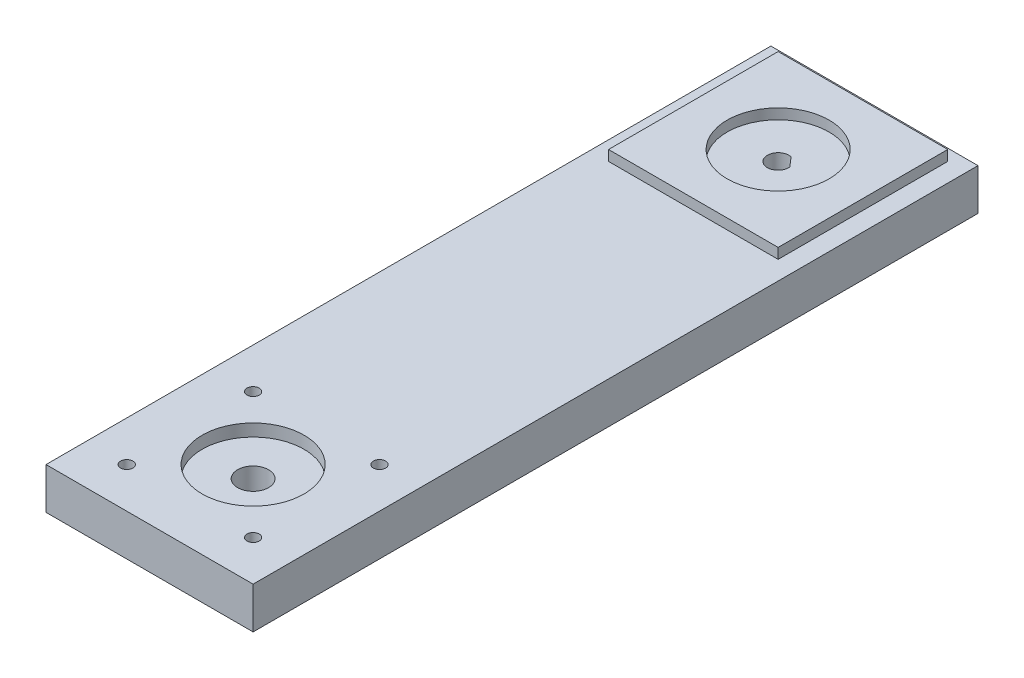
ISO-10303-21;
HEADER;
FILE_DESCRIPTION(('STEP AP214'),'2;1');
FILE_NAME('part.step','',(''),(''),'','','');
FILE_SCHEMA(('AUTOMOTIVE_DESIGN { 1 0 10303 214 1 1 1 1 }'));
ENDSEC;
DATA;
#1=APPLICATION_CONTEXT('core data for automotive mechanical design processes');
#2=APPLICATION_PROTOCOL_DEFINITION('international standard','automotive_design',2000,#1);
#3=PRODUCT_CONTEXT('',#1,'mechanical');
#4=PRODUCT('Part','Part','',(#3));
#5=PRODUCT_RELATED_PRODUCT_CATEGORY('part','',(#4));
#6=PRODUCT_DEFINITION_FORMATION('','',#4);
#7=PRODUCT_DEFINITION_CONTEXT('part definition',#1,'design');
#8=PRODUCT_DEFINITION('design','',#6,#7);
#9=PRODUCT_DEFINITION_SHAPE('','',#8);
#10=(LENGTH_UNIT() NAMED_UNIT(*) SI_UNIT(.MILLI.,.METRE.));
#11=(NAMED_UNIT(*) PLANE_ANGLE_UNIT() SI_UNIT($,.RADIAN.));
#12=(NAMED_UNIT(*) SI_UNIT($,.STERADIAN.) SOLID_ANGLE_UNIT());
#13=UNCERTAINTY_MEASURE_WITH_UNIT(LENGTH_MEASURE(1.E-05),#10,'distance_accuracy_value','');
#14=(GEOMETRIC_REPRESENTATION_CONTEXT(3) GLOBAL_UNCERTAINTY_ASSIGNED_CONTEXT((#13)) GLOBAL_UNIT_ASSIGNED_CONTEXT((#10,
#11,#12)) REPRESENTATION_CONTEXT('',''));
#15=CARTESIAN_POINT('',(0.,0.,0.));
#16=DIRECTION('',(0.,0.,1.));
#17=DIRECTION('',(1.,0.,0.));
#18=AXIS2_PLACEMENT_3D('',#15,#16,#17);
#19=CARTESIAN_POINT('',(0.,72.85,128.777676550252));
#20=DIRECTION('',(0.,-1.,0.));
#21=DIRECTION('',(0.,0.,-1.));
#22=AXIS2_PLACEMENT_3D('',#19,#20,#21);
#23=CYLINDRICAL_SURFACE('',#22,3.81);
#24=CARTESIAN_POINT('',(0.,41.91,128.777676550252));
#25=DIRECTION('',(0.,-1.,0.));
#26=DIRECTION('',(0.,0.,-1.));
#27=AXIS2_PLACEMENT_3D('',#24,#25,#26);
#28=CIRCLE('',#27,3.81);
#29=CARTESIAN_POINT('',(0.,41.91,124.967676550252));
#30=VERTEX_POINT('',#29);
#31=EDGE_CURVE('E214',#30,#30,#28,.T.);
#32=CARTESIAN_POINT('',(0.,49.07,128.777676550252));
#33=DIRECTION('',(0.,1.,0.));
#34=DIRECTION('',(0.,0.,1.));
#35=AXIS2_PLACEMENT_3D('',#32,#33,#34);
#36=CIRCLE('',#35,3.81);
#37=CARTESIAN_POINT('',(0.,49.07,124.967676550252));
#38=VERTEX_POINT('',#37);
#39=EDGE_CURVE('E195',#38,#38,#36,.F.);
#40=CARTESIAN_POINT('',(0.,41.91,124.967676550252));
#41=CARTESIAN_POINT('',(0.,41.9845833333333,124.967676550252));
#42=CARTESIAN_POINT('',(0.,42.0591666666667,124.967676550252));
#43=CARTESIAN_POINT('',(0.,42.2083333333333,124.967676550252));
#44=CARTESIAN_POINT('',(0.,42.2829166666667,124.967676550252));
#45=CARTESIAN_POINT('',(0.,42.4320833333333,124.967676550252));
#46=CARTESIAN_POINT('',(0.,42.5066666666667,124.967676550252));
#47=CARTESIAN_POINT('',(0.,42.6558333333333,124.967676550252));
#48=CARTESIAN_POINT('',(0.,42.7304166666667,124.967676550252));
#49=CARTESIAN_POINT('',(0.,42.8795833333333,124.967676550252));
#50=CARTESIAN_POINT('',(0.,42.9541666666667,124.967676550252));
#51=CARTESIAN_POINT('',(0.,43.1033333333333,124.967676550252));
#52=CARTESIAN_POINT('',(0.,43.1779166666667,124.967676550252));
#53=CARTESIAN_POINT('',(0.,43.3270833333333,124.967676550252));
#54=CARTESIAN_POINT('',(0.,43.4016666666667,124.967676550252));
#55=CARTESIAN_POINT('',(0.,43.5508333333333,124.967676550252));
#56=CARTESIAN_POINT('',(0.,43.6254166666667,124.967676550252));
#57=CARTESIAN_POINT('',(0.,43.7745833333333,124.967676550252));
#58=CARTESIAN_POINT('',(0.,43.8491666666667,124.967676550252));
#59=CARTESIAN_POINT('',(0.,43.9983333333333,124.967676550252));
#60=CARTESIAN_POINT('',(0.,44.0729166666667,124.967676550252));
#61=CARTESIAN_POINT('',(0.,44.2220833333333,124.967676550252));
#62=CARTESIAN_POINT('',(0.,44.2966666666667,124.967676550252));
#63=CARTESIAN_POINT('',(0.,44.4458333333333,124.967676550252));
#64=CARTESIAN_POINT('',(0.,44.5204166666667,124.967676550252));
#65=CARTESIAN_POINT('',(0.,44.6695833333333,124.967676550252));
#66=CARTESIAN_POINT('',(0.,44.7441666666667,124.967676550252));
#67=CARTESIAN_POINT('',(0.,44.8933333333333,124.967676550252));
#68=CARTESIAN_POINT('',(0.,44.9679166666667,124.967676550252));
#69=CARTESIAN_POINT('',(0.,45.1170833333333,124.967676550252));
#70=CARTESIAN_POINT('',(0.,45.1916666666667,124.967676550252));
#71=CARTESIAN_POINT('',(0.,45.3408333333333,124.967676550252));
#72=CARTESIAN_POINT('',(0.,45.4154166666667,124.967676550252));
#73=CARTESIAN_POINT('',(0.,45.5645833333333,124.967676550252));
#74=CARTESIAN_POINT('',(0.,45.6391666666667,124.967676550252));
#75=CARTESIAN_POINT('',(0.,45.7883333333333,124.967676550252));
#76=CARTESIAN_POINT('',(0.,45.8629166666667,124.967676550252));
#77=CARTESIAN_POINT('',(0.,46.0120833333333,124.967676550252));
#78=CARTESIAN_POINT('',(0.,46.0866666666667,124.967676550252));
#79=CARTESIAN_POINT('',(0.,46.2358333333333,124.967676550252));
#80=CARTESIAN_POINT('',(0.,46.3104166666667,124.967676550252));
#81=CARTESIAN_POINT('',(0.,46.4595833333333,124.967676550252));
#82=CARTESIAN_POINT('',(0.,46.5341666666667,124.967676550252));
#83=CARTESIAN_POINT('',(0.,46.6833333333333,124.967676550252));
#84=CARTESIAN_POINT('',(0.,46.7579166666667,124.967676550252));
#85=CARTESIAN_POINT('',(0.,46.9070833333333,124.967676550252));
#86=CARTESIAN_POINT('',(0.,46.9816666666667,124.967676550252));
#87=CARTESIAN_POINT('',(0.,47.1308333333333,124.967676550252));
#88=CARTESIAN_POINT('',(0.,47.2054166666667,124.967676550252));
#89=CARTESIAN_POINT('',(0.,47.3545833333333,124.967676550252));
#90=CARTESIAN_POINT('',(0.,47.4291666666667,124.967676550252));
#91=CARTESIAN_POINT('',(0.,47.5783333333333,124.967676550252));
#92=CARTESIAN_POINT('',(0.,47.6529166666667,124.967676550252));
#93=CARTESIAN_POINT('',(0.,47.8020833333333,124.967676550252));
#94=CARTESIAN_POINT('',(0.,47.8766666666667,124.967676550252));
#95=CARTESIAN_POINT('',(0.,48.0258333333333,124.967676550252));
#96=CARTESIAN_POINT('',(0.,48.1004166666667,124.967676550252));
#97=CARTESIAN_POINT('',(0.,48.2495833333333,124.967676550252));
#98=CARTESIAN_POINT('',(0.,48.3241666666667,124.967676550252));
#99=CARTESIAN_POINT('',(0.,48.4733333333333,124.967676550252));
#100=CARTESIAN_POINT('',(0.,48.5479166666667,124.967676550252));
#101=CARTESIAN_POINT('',(0.,48.6970833333333,124.967676550252));
#102=CARTESIAN_POINT('',(0.,48.7716666666667,124.967676550252));
#103=CARTESIAN_POINT('',(0.,48.9208333333333,124.967676550252));
#104=CARTESIAN_POINT('',(0.,48.9954166666667,124.967676550252));
#105=CARTESIAN_POINT('',(0.,49.07,124.967676550252));
#106=B_SPLINE_CURVE_WITH_KNOTS('',3,(#40,#41,#42,#43,#44,#45,#46,#47,#48,#49,#50,#51,#52,#53,
#54,#55,#56,#57,#58,#59,#60,#61,#62,#63,#64,#65,#66,#67,#68,#69,#70,#71,#72,#73,#74,#75,#76,#77,
#78,#79,#80,#81,#82,#83,#84,#85,#86,#87,#88,#89,#90,#91,#92,#93,#94,#95,#96,#97,#98,#99,#100,
#101,#102,#103,#104,#105),.UNSPECIFIED.,.F.,.F.,(4,2,2,2,2,2,2,2,2,2,2,2,2,2,2,2,2,2,2,2,2,2,2,
2,2,2,2,2,2,2,2,2,4),(0.,0.223749999999995,0.447499999999997,0.671249999999998,
0.894999999999993,1.11874999999999,1.3425,1.56624999999999,1.79,2.01374999999999,
2.23749999999999,2.46125,2.68499999999999,2.90874999999999,3.1325,3.35624999999999,
3.57999999999999,3.80374999999999,4.02749999999999,4.25124999999999,4.47499999999999,
4.69874999999999,4.9225,5.14624999999999,5.36999999999999,5.59374999999999,5.81749999999999,
6.04124999999999,6.26499999999999,6.48874999999999,6.71249999999999,6.93624999999999,
7.15999999999999),.UNSPECIFIED.);
#107=EDGE_CURVE('BSEAM41',#30,#38,#106,.T.);
#108=ORIENTED_EDGE('',*,*,#31,.T.);
#109=ORIENTED_EDGE('',*,*,#39,.F.);
#110=ORIENTED_EDGE('',*,*,#107,.T.);
#111=ORIENTED_EDGE('',*,*,#107,.F.);
#112=EDGE_LOOP('',(#108,#110,#109,#111));
#113=FACE_BOUND('',#112,.T.);
#114=ADVANCED_FACE('F41',(#113),#23,.F.);
#115=CARTESIAN_POINT('',(0.,52.07,0.));
#116=DIRECTION('',(0.,1.,0.));
#117=DIRECTION('',(0.,0.,1.));
#118=AXIS2_PLACEMENT_3D('',#115,#116,#117);
#119=PLANE('',#118);
#120=CARTESIAN_POINT('',(0.,52.07,0.));
#121=DIRECTION('',(0.,1.,0.));
#122=DIRECTION('',(0.,0.,1.));
#123=AXIS2_PLACEMENT_3D('',#120,#121,#122);
#124=CIRCLE('',#123,12.5);
#125=CARTESIAN_POINT('',(0.,52.07,12.5));
#126=VERTEX_POINT('',#125);
#127=EDGE_CURVE('E49',#126,#126,#124,.F.);
#128=ORIENTED_EDGE('',*,*,#127,.F.);
#129=EDGE_LOOP('',(#128));
#130=FACE_BOUND('',#129,.T.);
#131=CARTESIAN_POINT('',(0.,52.07,0.));
#132=DIRECTION('',(0.,1.,0.));
#133=DIRECTION('',(0.,0.,1.));
#134=AXIS2_PLACEMENT_3D('',#131,#132,#133);
#135=CIRCLE('',#134,2.6399145772898);
#136=CARTESIAN_POINT('',(0.602559076609882,52.07,-2.57022791490993));
#137=VERTEX_POINT('',#136);
#138=CARTESIAN_POINT('',(2.62841352465712,52.07,-0.246153039361187));
#139=VERTEX_POINT('',#138);
#140=EDGE_CURVE('E124',#137,#139,#135,.T.);
#141=ORIENTED_EDGE('',*,*,#140,.F.);
#142=DIRECTION('',(0.65708689551593,0.,0.753814839162269));
#143=VECTOR('',#142,1.);
#144=CARTESIAN_POINT('',(1.6154863006335,52.07,-1.40819047713556));
#145=LINE('',#144,#143);
#146=EDGE_CURVE('E233',#137,#139,#145,.T.);
#147=ORIENTED_EDGE('',*,*,#146,.T.);
#148=EDGE_LOOP('',(#141,#147));
#149=FACE_BOUND('',#148,.T.);
#150=ADVANCED_FACE('F235',(#130,#149),#119,.T.);
#151=CARTESIAN_POINT('',(-25.4,52.07,-23.6223234497477));
#152=DIRECTION('',(1.,0.,0.));
#153=DIRECTION('',(0.,0.,-1.));
#154=AXIS2_PLACEMENT_3D('',#151,#152,#153);
#155=PLANE('',#154);
#156=DIRECTION('',(0.,0.,1.));
#157=VECTOR('',#156,1.);
#158=CARTESIAN_POINT('',(-25.4,41.91,-23.6223234497477));
#159=LINE('',#158,#157);
#160=CARTESIAN_POINT('',(-25.4,41.91,-23.6223234497477));
#161=VERTEX_POINT('',#160);
#162=CARTESIAN_POINT('',(-25.4,41.91,154.177676550252));
#163=VERTEX_POINT('',#162);
#164=EDGE_CURVE('E165',#161,#163,#159,.T.);
#165=ORIENTED_EDGE('',*,*,#164,.T.);
#166=DIRECTION('',(0.,-1.,0.));
#167=VECTOR('',#166,1.);
#168=CARTESIAN_POINT('',(-25.4,52.07,154.177676550252));
#169=LINE('',#168,#167);
#170=CARTESIAN_POINT('',(-25.4,52.07,154.177676550252));
#171=VERTEX_POINT('',#170);
#172=EDGE_CURVE('E191',#171,#163,#169,.T.);
#173=ORIENTED_EDGE('',*,*,#172,.F.);
#174=DIRECTION('',(0.,0.,1.));
#175=VECTOR('',#174,1.);
#176=CARTESIAN_POINT('',(-25.4,52.07,-23.6223234497477));
#177=LINE('',#176,#175);
#178=CARTESIAN_POINT('',(-25.4,52.07,-23.6223234497477));
#179=VERTEX_POINT('',#178);
#180=EDGE_CURVE('E166',#179,#171,#177,.T.);
#181=ORIENTED_EDGE('',*,*,#180,.F.);
#182=DIRECTION('',(0.,-1.,0.));
#183=VECTOR('',#182,1.);
#184=CARTESIAN_POINT('',(-25.4,52.07,-23.6223234497477));
#185=LINE('',#184,#183);
#186=EDGE_CURVE('E176',#179,#161,#185,.T.);
#187=ORIENTED_EDGE('',*,*,#186,.T.);
#188=EDGE_LOOP('',(#165,#173,#181,#187));
#189=FACE_BOUND('',#188,.T.);
#190=ADVANCED_FACE('F43',(#189),#155,.F.);
#191=CARTESIAN_POINT('',(-25.4,52.07,154.177676550252));
#192=DIRECTION('',(0.,0.,-1.));
#193=DIRECTION('',(-1.,0.,0.));
#194=AXIS2_PLACEMENT_3D('',#191,#192,#193);
#195=PLANE('',#194);
#196=DIRECTION('',(1.,0.,0.));
#197=VECTOR('',#196,1.);
#198=CARTESIAN_POINT('',(-25.4,41.91,154.177676550252));
#199=LINE('',#198,#197);
#200=CARTESIAN_POINT('',(25.4,41.91,154.177676550252));
#201=VERTEX_POINT('',#200);
#202=EDGE_CURVE('E178',#163,#201,#199,.T.);
#203=ORIENTED_EDGE('',*,*,#202,.T.);
#204=DIRECTION('',(0.,-1.,0.));
#205=VECTOR('',#204,1.);
#206=CARTESIAN_POINT('',(25.4,52.07,154.177676550252));
#207=LINE('',#206,#205);
#208=CARTESIAN_POINT('',(25.4,52.07,154.177676550252));
#209=VERTEX_POINT('',#208);
#210=EDGE_CURVE('E188',#209,#201,#207,.T.);
#211=ORIENTED_EDGE('',*,*,#210,.F.);
#212=DIRECTION('',(1.,0.,0.));
#213=VECTOR('',#212,1.);
#214=CARTESIAN_POINT('',(-25.4,52.07,154.177676550252));
#215=LINE('',#214,#213);
#216=EDGE_CURVE('E169',#171,#209,#215,.T.);
#217=ORIENTED_EDGE('',*,*,#216,.F.);
#218=ORIENTED_EDGE('',*,*,#172,.T.);
#219=EDGE_LOOP('',(#203,#211,#217,#218));
#220=FACE_BOUND('',#219,.T.);
#221=ADVANCED_FACE('F245',(#220),#195,.F.);
#222=CARTESIAN_POINT('',(25.4,52.07,-23.6223234497477));
#223=DIRECTION('',(-1.,0.,0.));
#224=DIRECTION('',(0.,0.,1.));
#225=AXIS2_PLACEMENT_3D('',#222,#223,#224);
#226=PLANE('',#225);
#227=DIRECTION('',(0.,0.,-1.));
#228=VECTOR('',#227,1.);
#229=CARTESIAN_POINT('',(25.4,41.91,-23.6223234497477));
#230=LINE('',#229,#228);
#231=CARTESIAN_POINT('',(25.4,41.91,-23.6223234497477));
#232=VERTEX_POINT('',#231);
#233=EDGE_CURVE('E180',#201,#232,#230,.T.);
#234=ORIENTED_EDGE('',*,*,#233,.T.);
#235=DIRECTION('',(0.,-1.,0.));
#236=VECTOR('',#235,1.);
#237=CARTESIAN_POINT('',(25.4,52.07,-23.6223234497477));
#238=LINE('',#237,#236);
#239=CARTESIAN_POINT('',(25.4,52.07,-23.6223234497477));
#240=VERTEX_POINT('',#239);
#241=EDGE_CURVE('E185',#240,#232,#238,.T.);
#242=ORIENTED_EDGE('',*,*,#241,.F.);
#243=DIRECTION('',(0.,0.,-1.));
#244=VECTOR('',#243,1.);
#245=CARTESIAN_POINT('',(25.4,52.07,-23.6223234497477));
#246=LINE('',#245,#244);
#247=EDGE_CURVE('E172',#209,#240,#246,.T.);
#248=ORIENTED_EDGE('',*,*,#247,.F.);
#249=ORIENTED_EDGE('',*,*,#210,.T.);
#250=EDGE_LOOP('',(#234,#242,#248,#249));
#251=FACE_BOUND('',#250,.T.);
#252=ADVANCED_FACE('F263',(#251),#226,.F.);
#253=CARTESIAN_POINT('',(-25.4,52.07,-23.6223234497477));
#254=DIRECTION('',(0.,0.,1.));
#255=DIRECTION('',(1.,0.,0.));
#256=AXIS2_PLACEMENT_3D('',#253,#254,#255);
#257=PLANE('',#256);
#258=DIRECTION('',(-1.,0.,0.));
#259=VECTOR('',#258,1.);
#260=CARTESIAN_POINT('',(-25.4,41.91,-23.6223234497477));
#261=LINE('',#260,#259);
#262=EDGE_CURVE('E170',#232,#161,#261,.T.);
#263=ORIENTED_EDGE('',*,*,#262,.T.);
#264=ORIENTED_EDGE('',*,*,#186,.F.);
#265=DIRECTION('',(-1.,0.,0.));
#266=VECTOR('',#265,1.);
#267=CARTESIAN_POINT('',(-25.4,52.07,-23.6223234497477));
#268=LINE('',#267,#266);
#269=EDGE_CURVE('E174',#240,#179,#268,.T.);
#270=ORIENTED_EDGE('',*,*,#269,.F.);
#271=ORIENTED_EDGE('',*,*,#241,.T.);
#272=EDGE_LOOP('',(#263,#264,#270,#271));
#273=FACE_BOUND('',#272,.T.);
#274=ADVANCED_FACE('F254',(#273),#257,.F.);
#275=CARTESIAN_POINT('',(0.,52.07,128.777676550252));
#276=DIRECTION('',(0.,1.,0.));
#277=DIRECTION('',(0.,0.,1.));
#278=AXIS2_PLACEMENT_3D('',#275,#276,#277);
#279=CIRCLE('',#278,12.5);
#280=CARTESIAN_POINT('',(0.,52.07,141.277676550252));
#281=VERTEX_POINT('',#280);
#282=EDGE_CURVE('E120',#281,#281,#279,.T.);
#283=ORIENTED_EDGE('',*,*,#282,.F.);
#284=EDGE_LOOP('',(#283));
#285=FACE_BOUND('',#284,.T.);
#286=CARTESIAN_POINT('',(-15.5,52.07,113.277676550252));
#287=DIRECTION('',(0.,1.,0.));
#288=DIRECTION('',(0.,0.,1.));
#289=AXIS2_PLACEMENT_3D('',#286,#287,#288);
#290=CIRCLE('',#289,1.5);
#291=CARTESIAN_POINT('',(-15.5,52.07,111.777676550252));
#292=VERTEX_POINT('',#291);
#293=EDGE_CURVE('E231',#292,#292,#290,.T.);
#294=ORIENTED_EDGE('',*,*,#293,.F.);
#295=EDGE_LOOP('',(#294));
#296=FACE_BOUND('',#295,.T.);
#297=CARTESIAN_POINT('',(-15.5,52.07,144.277676550252));
#298=DIRECTION('',(0.,1.,0.));
#299=DIRECTION('',(0.,0.,1.));
#300=AXIS2_PLACEMENT_3D('',#297,#298,#299);
#301=CIRCLE('',#300,1.5);
#302=CARTESIAN_POINT('',(-15.5,52.07,142.777676550252));
#303=VERTEX_POINT('',#302);
#304=EDGE_CURVE('E228',#303,#303,#301,.T.);
#305=ORIENTED_EDGE('',*,*,#304,.F.);
#306=EDGE_LOOP('',(#305));
#307=FACE_BOUND('',#306,.T.);
#308=CARTESIAN_POINT('',(15.5,52.07,144.277676550252));
#309=DIRECTION('',(0.,1.,0.));
#310=DIRECTION('',(0.,0.,1.));
#311=AXIS2_PLACEMENT_3D('',#308,#309,#310);
#312=CIRCLE('',#311,1.5);
#313=CARTESIAN_POINT('',(15.5,52.07,142.777676550252));
#314=VERTEX_POINT('',#313);
#315=EDGE_CURVE('E225',#314,#314,#312,.T.);
#316=ORIENTED_EDGE('',*,*,#315,.F.);
#317=EDGE_LOOP('',(#316));
#318=FACE_BOUND('',#317,.T.);
#319=CARTESIAN_POINT('',(15.5,52.07,113.277676550252));
#320=DIRECTION('',(0.,1.,0.));
#321=DIRECTION('',(0.,0.,1.));
#322=AXIS2_PLACEMENT_3D('',#319,#320,#321);
#323=CIRCLE('',#322,1.5);
#324=CARTESIAN_POINT('',(15.5,52.07,111.777676550252));
#325=VERTEX_POINT('',#324);
#326=EDGE_CURVE('E222',#325,#325,#323,.T.);
#327=ORIENTED_EDGE('',*,*,#326,.F.);
#328=EDGE_LOOP('',(#327));
#329=FACE_BOUND('',#328,.T.);
#330=DIRECTION('',(0.,0.,-1.));
#331=VECTOR('',#330,1.);
#332=CARTESIAN_POINT('',(-20.7995624568902,52.07,0.));
#333=LINE('',#332,#331);
#334=CARTESIAN_POINT('',(-20.7995624568902,52.07,20.7995624568902));
#335=VERTEX_POINT('',#334);
#336=CARTESIAN_POINT('',(-20.7995624568902,52.07,-20.7995624568902));
#337=VERTEX_POINT('',#336);
#338=EDGE_CURVE('E126',#335,#337,#333,.T.);
#339=ORIENTED_EDGE('',*,*,#338,.T.);
#340=DIRECTION('',(-1.,0.,0.));
#341=VECTOR('',#340,1.);
#342=CARTESIAN_POINT('',(0.,52.07,-20.7995624568902));
#343=LINE('',#342,#341);
#344=CARTESIAN_POINT('',(20.7995624568902,52.07,-20.7995624568902));
#345=VERTEX_POINT('',#344);
#346=EDGE_CURVE('E139',#345,#337,#343,.T.);
#347=ORIENTED_EDGE('',*,*,#346,.F.);
#348=DIRECTION('',(0.,0.,-1.));
#349=VECTOR('',#348,1.);
#350=CARTESIAN_POINT('',(20.7995624568902,52.07,0.));
#351=LINE('',#350,#349);
#352=CARTESIAN_POINT('',(20.7995624568902,52.07,20.7995624568902));
#353=VERTEX_POINT('',#352);
#354=EDGE_CURVE('E153',#353,#345,#351,.T.);
#355=ORIENTED_EDGE('',*,*,#354,.F.);
#356=DIRECTION('',(-1.,0.,0.));
#357=VECTOR('',#356,1.);
#358=CARTESIAN_POINT('',(0.,52.07,20.7995624568902));
#359=LINE('',#358,#357);
#360=EDGE_CURVE('E129',#353,#335,#359,.T.);
#361=ORIENTED_EDGE('',*,*,#360,.T.);
#362=EDGE_LOOP('',(#339,#347,#355,#361));
#363=FACE_BOUND('',#362,.T.);
#364=ORIENTED_EDGE('',*,*,#180,.T.);
#365=ORIENTED_EDGE('',*,*,#216,.T.);
#366=ORIENTED_EDGE('',*,*,#247,.T.);
#367=ORIENTED_EDGE('',*,*,#269,.T.);
#368=EDGE_LOOP('',(#364,#365,#366,#367));
#369=FACE_BOUND('',#368,.T.);
#370=ADVANCED_FACE('F239',(#285,#296,#307,#318,#329,#363,#369),#119,.T.);
#371=CARTESIAN_POINT('',(0.,41.91,0.));
#372=DIRECTION('',(0.,1.,0.));
#373=DIRECTION('',(0.,0.,1.));
#374=AXIS2_PLACEMENT_3D('',#371,#372,#373);
#375=PLANE('',#374);
#376=CARTESIAN_POINT('',(-15.5,41.91,113.277676550252));
#377=DIRECTION('',(0.,-1.,0.));
#378=DIRECTION('',(0.,0.,-1.));
#379=AXIS2_PLACEMENT_3D('',#376,#377,#378);
#380=CIRCLE('',#379,1.5);
#381=CARTESIAN_POINT('',(-15.5,41.91,111.777676550252));
#382=VERTEX_POINT('',#381);
#383=EDGE_CURVE('E197',#382,#382,#380,.T.);
#384=ORIENTED_EDGE('',*,*,#383,.F.);
#385=EDGE_LOOP('',(#384));
#386=FACE_BOUND('',#385,.T.);
#387=CARTESIAN_POINT('',(-15.5,41.91,144.277676550252));
#388=DIRECTION('',(0.,-1.,0.));
#389=DIRECTION('',(0.,0.,-1.));
#390=AXIS2_PLACEMENT_3D('',#387,#388,#389);
#391=CIRCLE('',#390,1.5);
#392=CARTESIAN_POINT('',(-15.5,41.91,142.777676550252));
#393=VERTEX_POINT('',#392);
#394=EDGE_CURVE('E202',#393,#393,#391,.T.);
#395=ORIENTED_EDGE('',*,*,#394,.F.);
#396=EDGE_LOOP('',(#395));
#397=FACE_BOUND('',#396,.T.);
#398=CARTESIAN_POINT('',(15.5,41.91,144.277676550252));
#399=DIRECTION('',(0.,-1.,0.));
#400=DIRECTION('',(0.,0.,-1.));
#401=AXIS2_PLACEMENT_3D('',#398,#399,#400);
#402=CIRCLE('',#401,1.5);
#403=CARTESIAN_POINT('',(15.5,41.91,142.777676550252));
#404=VERTEX_POINT('',#403);
#405=EDGE_CURVE('E215',#404,#404,#402,.T.);
#406=ORIENTED_EDGE('',*,*,#405,.F.);
#407=EDGE_LOOP('',(#406));
#408=FACE_BOUND('',#407,.T.);
#409=CARTESIAN_POINT('',(15.5,41.91,113.277676550252));
#410=DIRECTION('',(0.,-1.,0.));
#411=DIRECTION('',(0.,0.,-1.));
#412=AXIS2_PLACEMENT_3D('',#409,#410,#411);
#413=CIRCLE('',#412,1.5);
#414=CARTESIAN_POINT('',(15.5,41.91,111.777676550252));
#415=VERTEX_POINT('',#414);
#416=EDGE_CURVE('E211',#415,#415,#413,.T.);
#417=ORIENTED_EDGE('',*,*,#416,.F.);
#418=EDGE_LOOP('',(#417));
#419=FACE_BOUND('',#418,.T.);
#420=ORIENTED_EDGE('',*,*,#31,.F.);
#421=EDGE_LOOP('',(#420));
#422=FACE_BOUND('',#421,.T.);
#423=ORIENTED_EDGE('',*,*,#202,.F.);
#424=ORIENTED_EDGE('',*,*,#164,.F.);
#425=ORIENTED_EDGE('',*,*,#262,.F.);
#426=ORIENTED_EDGE('',*,*,#233,.F.);
#427=EDGE_LOOP('',(#423,#424,#425,#426));
#428=FACE_BOUND('',#427,.T.);
#429=DIRECTION('',(-0.65708689551593,0.,-0.753814839162269));
#430=VECTOR('',#429,1.);
#431=CARTESIAN_POINT('',(1.6154863006335,41.91,-1.40819047713556));
#432=LINE('',#431,#430);
#433=CARTESIAN_POINT('',(2.62841352465712,41.91,-0.246153039361187));
#434=VERTEX_POINT('',#433);
#435=CARTESIAN_POINT('',(0.602559076609882,41.91,-2.57022791490993));
#436=VERTEX_POINT('',#435);
#437=EDGE_CURVE('E55',#434,#436,#432,.T.);
#438=ORIENTED_EDGE('',*,*,#437,.T.);
#439=CARTESIAN_POINT('',(0.,41.91,0.));
#440=DIRECTION('',(0.,1.,0.));
#441=DIRECTION('',(0.,0.,1.));
#442=AXIS2_PLACEMENT_3D('',#439,#440,#441);
#443=CIRCLE('',#442,2.6399145772898);
#444=EDGE_CURVE('E11',#434,#436,#443,.F.);
#445=ORIENTED_EDGE('',*,*,#444,.F.);
#446=EDGE_LOOP('',(#438,#445));
#447=FACE_BOUND('',#446,.T.);
#448=ADVANCED_FACE('F115',(#386,#397,#408,#419,#422,#428,#447),#375,.F.);
#449=CARTESIAN_POINT('',(-20.7995624568902,54.61,0.));
#450=DIRECTION('',(-1.,0.,0.));
#451=DIRECTION('',(0.,0.,1.));
#452=AXIS2_PLACEMENT_3D('',#449,#450,#451);
#453=PLANE('',#452);
#454=ORIENTED_EDGE('',*,*,#338,.F.);
#455=DIRECTION('',(0.,-1.,0.));
#456=VECTOR('',#455,1.);
#457=CARTESIAN_POINT('',(-20.7995624568902,54.61,20.7995624568902));
#458=LINE('',#457,#456);
#459=CARTESIAN_POINT('',(-20.7995624568902,54.61,20.7995624568902));
#460=VERTEX_POINT('',#459);
#461=EDGE_CURVE('E163',#460,#335,#458,.T.);
#462=ORIENTED_EDGE('',*,*,#461,.F.);
#463=DIRECTION('',(0.,0.,-1.));
#464=VECTOR('',#463,1.);
#465=CARTESIAN_POINT('',(-20.7995624568902,54.61,0.));
#466=LINE('',#465,#464);
#467=CARTESIAN_POINT('',(-20.7995624568902,54.61,-20.7995624568902));
#468=VERTEX_POINT('',#467);
#469=EDGE_CURVE('E138',#460,#468,#466,.T.);
#470=ORIENTED_EDGE('',*,*,#469,.T.);
#471=DIRECTION('',(0.,-1.,0.));
#472=VECTOR('',#471,1.);
#473=CARTESIAN_POINT('',(-20.7995624568902,54.61,-20.7995624568902));
#474=LINE('',#473,#472);
#475=EDGE_CURVE('E149',#468,#337,#474,.T.);
#476=ORIENTED_EDGE('',*,*,#475,.T.);
#477=EDGE_LOOP('',(#454,#462,#470,#476));
#478=FACE_BOUND('',#477,.T.);
#479=ADVANCED_FACE('F260',(#478),#453,.T.);
#480=CARTESIAN_POINT('',(0.,54.61,20.7995624568902));
#481=DIRECTION('',(0.,0.,1.));
#482=DIRECTION('',(1.,0.,0.));
#483=AXIS2_PLACEMENT_3D('',#480,#481,#482);
#484=PLANE('',#483);
#485=ORIENTED_EDGE('',*,*,#360,.F.);
#486=DIRECTION('',(0.,-1.,0.));
#487=VECTOR('',#486,1.);
#488=CARTESIAN_POINT('',(20.7995624568902,54.61,20.7995624568902));
#489=LINE('',#488,#487);
#490=CARTESIAN_POINT('',(20.7995624568902,54.61,20.7995624568902));
#491=VERTEX_POINT('',#490);
#492=EDGE_CURVE('E161',#491,#353,#489,.T.);
#493=ORIENTED_EDGE('',*,*,#492,.F.);
#494=DIRECTION('',(-1.,0.,0.));
#495=VECTOR('',#494,1.);
#496=CARTESIAN_POINT('',(0.,54.61,20.7995624568902));
#497=LINE('',#496,#495);
#498=EDGE_CURVE('E142',#491,#460,#497,.T.);
#499=ORIENTED_EDGE('',*,*,#498,.T.);
#500=ORIENTED_EDGE('',*,*,#461,.T.);
#501=EDGE_LOOP('',(#485,#493,#499,#500));
#502=FACE_BOUND('',#501,.T.);
#503=ADVANCED_FACE('F313',(#502),#484,.T.);
#504=CARTESIAN_POINT('',(20.7995624568902,54.61,0.));
#505=DIRECTION('',(-1.,0.,0.));
#506=DIRECTION('',(0.,0.,1.));
#507=AXIS2_PLACEMENT_3D('',#504,#505,#506);
#508=PLANE('',#507);
#509=ORIENTED_EDGE('',*,*,#354,.T.);
#510=DIRECTION('',(0.,-1.,0.));
#511=VECTOR('',#510,1.);
#512=CARTESIAN_POINT('',(20.7995624568902,54.61,-20.7995624568902));
#513=LINE('',#512,#511);
#514=CARTESIAN_POINT('',(20.7995624568902,54.61,-20.7995624568902));
#515=VERTEX_POINT('',#514);
#516=EDGE_CURVE('E158',#515,#345,#513,.T.);
#517=ORIENTED_EDGE('',*,*,#516,.F.);
#518=DIRECTION('',(0.,0.,-1.));
#519=VECTOR('',#518,1.);
#520=CARTESIAN_POINT('',(20.7995624568902,54.61,0.));
#521=LINE('',#520,#519);
#522=EDGE_CURVE('E145',#491,#515,#521,.T.);
#523=ORIENTED_EDGE('',*,*,#522,.F.);
#524=ORIENTED_EDGE('',*,*,#492,.T.);
#525=EDGE_LOOP('',(#509,#517,#523,#524));
#526=FACE_BOUND('',#525,.T.);
#527=ADVANCED_FACE('F323',(#526),#508,.F.);
#528=CARTESIAN_POINT('',(0.,54.61,0.));
#529=DIRECTION('',(0.,-1.,0.));
#530=DIRECTION('',(0.,0.,-1.));
#531=AXIS2_PLACEMENT_3D('',#528,#529,#530);
#532=CYLINDRICAL_SURFACE('',#531,12.5);
#533=CARTESIAN_POINT('',(0.,54.61,0.));
#534=DIRECTION('',(0.,1.,0.));
#535=DIRECTION('',(0.,0.,1.));
#536=AXIS2_PLACEMENT_3D('',#533,#534,#535);
#537=CIRCLE('',#536,12.5);
#538=CARTESIAN_POINT('',(0.,54.61,12.5));
#539=VERTEX_POINT('',#538);
#540=EDGE_CURVE('E135',#539,#539,#537,.T.);
#541=ORIENTED_EDGE('',*,*,#540,.T.);
#542=EDGE_LOOP('',(#541));
#543=FACE_BOUND('',#542,.T.);
#544=ORIENTED_EDGE('',*,*,#127,.T.);
#545=EDGE_LOOP('',(#544));
#546=FACE_BOUND('',#545,.T.);
#547=ADVANCED_FACE('F332',(#543,#546),#532,.F.);
#548=CARTESIAN_POINT('',(0.,54.61,-20.7995624568902));
#549=DIRECTION('',(0.,0.,1.));
#550=DIRECTION('',(1.,0.,0.));
#551=AXIS2_PLACEMENT_3D('',#548,#549,#550);
#552=PLANE('',#551);
#553=ORIENTED_EDGE('',*,*,#346,.T.);
#554=ORIENTED_EDGE('',*,*,#475,.F.);
#555=DIRECTION('',(-1.,0.,0.));
#556=VECTOR('',#555,1.);
#557=CARTESIAN_POINT('',(0.,54.61,-20.7995624568902));
#558=LINE('',#557,#556);
#559=EDGE_CURVE('E148',#515,#468,#558,.T.);
#560=ORIENTED_EDGE('',*,*,#559,.F.);
#561=ORIENTED_EDGE('',*,*,#516,.T.);
#562=EDGE_LOOP('',(#553,#554,#560,#561));
#563=FACE_BOUND('',#562,.T.);
#564=ADVANCED_FACE('F341',(#563),#552,.F.);
#565=CARTESIAN_POINT('',(0.,54.61,0.));
#566=DIRECTION('',(0.,1.,0.));
#567=DIRECTION('',(0.,0.,1.));
#568=AXIS2_PLACEMENT_3D('',#565,#566,#567);
#569=PLANE('',#568);
#570=ORIENTED_EDGE('',*,*,#540,.F.);
#571=EDGE_LOOP('',(#570));
#572=FACE_BOUND('',#571,.T.);
#573=ORIENTED_EDGE('',*,*,#469,.F.);
#574=ORIENTED_EDGE('',*,*,#498,.F.);
#575=ORIENTED_EDGE('',*,*,#522,.T.);
#576=ORIENTED_EDGE('',*,*,#559,.T.);
#577=EDGE_LOOP('',(#573,#574,#575,#576));
#578=FACE_BOUND('',#577,.T.);
#579=ADVANCED_FACE('F348',(#572,#578),#569,.T.);
#580=CARTESIAN_POINT('',(1.6154863006335,27.07,-1.40819047713556));
#581=DIRECTION('',(-0.753814839162269,0.,0.65708689551593));
#582=DIRECTION('',(0.65708689551593,0.,0.753814839162269));
#583=AXIS2_PLACEMENT_3D('',#580,#581,#582);
#584=PLANE('',#583);
#585=ORIENTED_EDGE('',*,*,#437,.F.);
#586=DIRECTION('',(0.,1.,0.));
#587=VECTOR('',#586,1.);
#588=CARTESIAN_POINT('',(2.62841352465712,27.07,-0.246153039361187));
#589=LINE('',#588,#587);
#590=EDGE_CURVE('E119',#434,#139,#589,.T.);
#591=ORIENTED_EDGE('',*,*,#590,.T.);
#592=ORIENTED_EDGE('',*,*,#146,.F.);
#593=DIRECTION('',(0.,1.,0.));
#594=VECTOR('',#593,1.);
#595=CARTESIAN_POINT('',(0.602559076609882,27.07,-2.57022791490993));
#596=LINE('',#595,#594);
#597=EDGE_CURVE('E61',#436,#137,#596,.T.);
#598=ORIENTED_EDGE('',*,*,#597,.F.);
#599=EDGE_LOOP('',(#585,#591,#592,#598));
#600=FACE_BOUND('',#599,.T.);
#601=ADVANCED_FACE('F118',(#600),#584,.T.);
#602=CARTESIAN_POINT('',(0.,27.07,0.));
#603=DIRECTION('',(0.,1.,0.));
#604=DIRECTION('',(0.,0.,1.));
#605=AXIS2_PLACEMENT_3D('',#602,#603,#604);
#606=CYLINDRICAL_SURFACE('',#605,2.6399145772898);
#607=ORIENTED_EDGE('',*,*,#590,.F.);
#608=ORIENTED_EDGE('',*,*,#444,.T.);
#609=ORIENTED_EDGE('',*,*,#597,.T.);
#610=ORIENTED_EDGE('',*,*,#140,.T.);
#611=EDGE_LOOP('',(#607,#608,#609,#610));
#612=FACE_BOUND('',#611,.T.);
#613=ADVANCED_FACE('F122',(#612),#606,.F.);
#614=CARTESIAN_POINT('',(15.5,72.85,113.277676550252));
#615=DIRECTION('',(0.,-1.,0.));
#616=DIRECTION('',(0.,0.,-1.));
#617=AXIS2_PLACEMENT_3D('',#614,#615,#616);
#618=CYLINDRICAL_SURFACE('',#617,1.5);
#619=CARTESIAN_POINT('',(15.5,52.07,111.777676550252));
#620=CARTESIAN_POINT('',(15.5,51.9641666666667,111.777676550252));
#621=CARTESIAN_POINT('',(15.5,51.8583333333333,111.777676550252));
#622=CARTESIAN_POINT('',(15.5,51.6466666666667,111.777676550252));
#623=CARTESIAN_POINT('',(15.5,51.5408333333333,111.777676550252));
#624=CARTESIAN_POINT('',(15.5,51.3291666666667,111.777676550252));
#625=CARTESIAN_POINT('',(15.5,51.2233333333333,111.777676550252));
#626=CARTESIAN_POINT('',(15.5,51.0116666666667,111.777676550252));
#627=CARTESIAN_POINT('',(15.5,50.9058333333333,111.777676550252));
#628=CARTESIAN_POINT('',(15.5,50.6941666666667,111.777676550252));
#629=CARTESIAN_POINT('',(15.5,50.5883333333333,111.777676550252));
#630=CARTESIAN_POINT('',(15.5,50.3766666666667,111.777676550252));
#631=CARTESIAN_POINT('',(15.5,50.2708333333333,111.777676550252));
#632=CARTESIAN_POINT('',(15.5,50.0591666666667,111.777676550252));
#633=CARTESIAN_POINT('',(15.5,49.9533333333333,111.777676550252));
#634=CARTESIAN_POINT('',(15.5,49.7416666666667,111.777676550252));
#635=CARTESIAN_POINT('',(15.5,49.6358333333333,111.777676550252));
#636=CARTESIAN_POINT('',(15.5,49.4241666666667,111.777676550252));
#637=CARTESIAN_POINT('',(15.5,49.3183333333333,111.777676550252));
#638=CARTESIAN_POINT('',(15.5,49.1066666666667,111.777676550252));
#639=CARTESIAN_POINT('',(15.5,49.0008333333333,111.777676550252));
#640=CARTESIAN_POINT('',(15.5,48.7891666666667,111.777676550252));
#641=CARTESIAN_POINT('',(15.5,48.6833333333333,111.777676550252));
#642=CARTESIAN_POINT('',(15.5,48.4716666666667,111.777676550252));
#643=CARTESIAN_POINT('',(15.5,48.3658333333333,111.777676550252));
#644=CARTESIAN_POINT('',(15.5,48.1541666666667,111.777676550252));
#645=CARTESIAN_POINT('',(15.5,48.0483333333333,111.777676550252));
#646=CARTESIAN_POINT('',(15.5,47.8366666666667,111.777676550252));
#647=CARTESIAN_POINT('',(15.5,47.7308333333333,111.777676550252));
#648=CARTESIAN_POINT('',(15.5,47.5191666666667,111.777676550252));
#649=CARTESIAN_POINT('',(15.5,47.4133333333333,111.777676550252));
#650=CARTESIAN_POINT('',(15.5,47.2016666666667,111.777676550252));
#651=CARTESIAN_POINT('',(15.5,47.0958333333333,111.777676550252));
#652=CARTESIAN_POINT('',(15.5,46.8841666666667,111.777676550252));
#653=CARTESIAN_POINT('',(15.5,46.7783333333333,111.777676550252));
#654=CARTESIAN_POINT('',(15.5,46.5666666666667,111.777676550252));
#655=CARTESIAN_POINT('',(15.5,46.4608333333333,111.777676550252));
#656=CARTESIAN_POINT('',(15.5,46.2491666666667,111.777676550252));
#657=CARTESIAN_POINT('',(15.5,46.1433333333333,111.777676550252));
#658=CARTESIAN_POINT('',(15.5,45.9316666666667,111.777676550252));
#659=CARTESIAN_POINT('',(15.5,45.8258333333333,111.777676550252));
#660=CARTESIAN_POINT('',(15.5,45.6141666666667,111.777676550252));
#661=CARTESIAN_POINT('',(15.5,45.5083333333333,111.777676550252));
#662=CARTESIAN_POINT('',(15.5,45.2966666666667,111.777676550252));
#663=CARTESIAN_POINT('',(15.5,45.1908333333333,111.777676550252));
#664=CARTESIAN_POINT('',(15.5,44.9791666666667,111.777676550252));
#665=CARTESIAN_POINT('',(15.5,44.8733333333333,111.777676550252));
#666=CARTESIAN_POINT('',(15.5,44.6616666666667,111.777676550252));
#667=CARTESIAN_POINT('',(15.5,44.5558333333333,111.777676550252));
#668=CARTESIAN_POINT('',(15.5,44.3441666666667,111.777676550252));
#669=CARTESIAN_POINT('',(15.5,44.2383333333333,111.777676550252));
#670=CARTESIAN_POINT('',(15.5,44.0266666666667,111.777676550252));
#671=CARTESIAN_POINT('',(15.5,43.9208333333333,111.777676550252));
#672=CARTESIAN_POINT('',(15.5,43.7091666666667,111.777676550252));
#673=CARTESIAN_POINT('',(15.5,43.6033333333333,111.777676550252));
#674=CARTESIAN_POINT('',(15.5,43.3916666666667,111.777676550252));
#675=CARTESIAN_POINT('',(15.5,43.2858333333333,111.777676550252));
#676=CARTESIAN_POINT('',(15.5,43.0741666666667,111.777676550252));
#677=CARTESIAN_POINT('',(15.5,42.9683333333333,111.777676550252));
#678=CARTESIAN_POINT('',(15.5,42.7566666666667,111.777676550252));
#679=CARTESIAN_POINT('',(15.5,42.6508333333333,111.777676550252));
#680=CARTESIAN_POINT('',(15.5,42.4391666666667,111.777676550252));
#681=CARTESIAN_POINT('',(15.5,42.3333333333333,111.777676550252));
#682=CARTESIAN_POINT('',(15.5,42.1216666666667,111.777676550252));
#683=CARTESIAN_POINT('',(15.5,42.0158333333333,111.777676550252));
#684=CARTESIAN_POINT('',(15.5,41.91,111.777676550252));
#685=B_SPLINE_CURVE_WITH_KNOTS('',3,(#619,#620,#621,#622,#623,#624,#625,#626,#627,#628,#629,
#630,#631,#632,#633,#634,#635,#636,#637,#638,#639,#640,#641,#642,#643,#644,#645,#646,#647,#648,
#649,#650,#651,#652,#653,#654,#655,#656,#657,#658,#659,#660,#661,#662,#663,#664,#665,#666,#667,
#668,#669,#670,#671,#672,#673,#674,#675,#676,#677,#678,#679,#680,#681,#682,#683,#684),
.UNSPECIFIED.,.F.,.F.,(4,2,2,2,2,2,2,2,2,2,2,2,2,2,2,2,2,2,2,2,2,2,2,2,2,2,2,2,2,2,2,2,4),(0.,
0.317499999999998,0.634999999999997,0.952499999999995,1.26999999999999,1.58749999999999,1.905,
2.2225,2.54,2.8575,3.175,3.4925,3.80999999999999,4.12749999999999,4.44499999999999,
4.76249999999999,5.07999999999999,5.3975,5.715,6.0325,6.34999999999999,6.66749999999999,
6.98499999999999,7.30249999999999,7.61999999999999,7.93749999999999,8.255,8.5725,8.89,
9.20749999999999,9.52499999999999,9.84249999999999,10.16),.UNSPECIFIED.);
#686=EDGE_CURVE('BSEAM380',#325,#415,#685,.T.);
#687=ORIENTED_EDGE('',*,*,#326,.T.);
#688=ORIENTED_EDGE('',*,*,#416,.T.);
#689=ORIENTED_EDGE('',*,*,#686,.T.);
#690=ORIENTED_EDGE('',*,*,#686,.F.);
#691=EDGE_LOOP('',(#687,#689,#688,#690));
#692=FACE_BOUND('',#691,.T.);
#693=ADVANCED_FACE('F380',(#692),#618,.F.);
#694=CARTESIAN_POINT('',(15.5,72.85,144.277676550252));
#695=DIRECTION('',(0.,-1.,0.));
#696=DIRECTION('',(0.,0.,-1.));
#697=AXIS2_PLACEMENT_3D('',#694,#695,#696);
#698=CYLINDRICAL_SURFACE('',#697,1.5);
#699=CARTESIAN_POINT('',(15.5,52.07,142.777676550252));
#700=CARTESIAN_POINT('',(15.5,51.9641666666667,142.777676550252));
#701=CARTESIAN_POINT('',(15.5,51.8583333333333,142.777676550252));
#702=CARTESIAN_POINT('',(15.5,51.6466666666667,142.777676550252));
#703=CARTESIAN_POINT('',(15.5,51.5408333333333,142.777676550252));
#704=CARTESIAN_POINT('',(15.5,51.3291666666667,142.777676550252));
#705=CARTESIAN_POINT('',(15.5,51.2233333333333,142.777676550252));
#706=CARTESIAN_POINT('',(15.5,51.0116666666667,142.777676550252));
#707=CARTESIAN_POINT('',(15.5,50.9058333333333,142.777676550252));
#708=CARTESIAN_POINT('',(15.5,50.6941666666667,142.777676550252));
#709=CARTESIAN_POINT('',(15.5,50.5883333333333,142.777676550252));
#710=CARTESIAN_POINT('',(15.5,50.3766666666667,142.777676550252));
#711=CARTESIAN_POINT('',(15.5,50.2708333333333,142.777676550252));
#712=CARTESIAN_POINT('',(15.5,50.0591666666667,142.777676550252));
#713=CARTESIAN_POINT('',(15.5,49.9533333333333,142.777676550252));
#714=CARTESIAN_POINT('',(15.5,49.7416666666667,142.777676550252));
#715=CARTESIAN_POINT('',(15.5,49.6358333333333,142.777676550252));
#716=CARTESIAN_POINT('',(15.5,49.4241666666667,142.777676550252));
#717=CARTESIAN_POINT('',(15.5,49.3183333333333,142.777676550252));
#718=CARTESIAN_POINT('',(15.5,49.1066666666667,142.777676550252));
#719=CARTESIAN_POINT('',(15.5,49.0008333333333,142.777676550252));
#720=CARTESIAN_POINT('',(15.5,48.7891666666667,142.777676550252));
#721=CARTESIAN_POINT('',(15.5,48.6833333333333,142.777676550252));
#722=CARTESIAN_POINT('',(15.5,48.4716666666667,142.777676550252));
#723=CARTESIAN_POINT('',(15.5,48.3658333333333,142.777676550252));
#724=CARTESIAN_POINT('',(15.5,48.1541666666667,142.777676550252));
#725=CARTESIAN_POINT('',(15.5,48.0483333333333,142.777676550252));
#726=CARTESIAN_POINT('',(15.5,47.8366666666667,142.777676550252));
#727=CARTESIAN_POINT('',(15.5,47.7308333333333,142.777676550252));
#728=CARTESIAN_POINT('',(15.5,47.5191666666667,142.777676550252));
#729=CARTESIAN_POINT('',(15.5,47.4133333333333,142.777676550252));
#730=CARTESIAN_POINT('',(15.5,47.2016666666667,142.777676550252));
#731=CARTESIAN_POINT('',(15.5,47.0958333333333,142.777676550252));
#732=CARTESIAN_POINT('',(15.5,46.8841666666667,142.777676550252));
#733=CARTESIAN_POINT('',(15.5,46.7783333333333,142.777676550252));
#734=CARTESIAN_POINT('',(15.5,46.5666666666667,142.777676550252));
#735=CARTESIAN_POINT('',(15.5,46.4608333333333,142.777676550252));
#736=CARTESIAN_POINT('',(15.5,46.2491666666667,142.777676550252));
#737=CARTESIAN_POINT('',(15.5,46.1433333333333,142.777676550252));
#738=CARTESIAN_POINT('',(15.5,45.9316666666667,142.777676550252));
#739=CARTESIAN_POINT('',(15.5,45.8258333333333,142.777676550252));
#740=CARTESIAN_POINT('',(15.5,45.6141666666667,142.777676550252));
#741=CARTESIAN_POINT('',(15.5,45.5083333333333,142.777676550252));
#742=CARTESIAN_POINT('',(15.5,45.2966666666667,142.777676550252));
#743=CARTESIAN_POINT('',(15.5,45.1908333333333,142.777676550252));
#744=CARTESIAN_POINT('',(15.5,44.9791666666667,142.777676550252));
#745=CARTESIAN_POINT('',(15.5,44.8733333333333,142.777676550252));
#746=CARTESIAN_POINT('',(15.5,44.6616666666667,142.777676550252));
#747=CARTESIAN_POINT('',(15.5,44.5558333333333,142.777676550252));
#748=CARTESIAN_POINT('',(15.5,44.3441666666667,142.777676550252));
#749=CARTESIAN_POINT('',(15.5,44.2383333333333,142.777676550252));
#750=CARTESIAN_POINT('',(15.5,44.0266666666667,142.777676550252));
#751=CARTESIAN_POINT('',(15.5,43.9208333333333,142.777676550252));
#752=CARTESIAN_POINT('',(15.5,43.7091666666667,142.777676550252));
#753=CARTESIAN_POINT('',(15.5,43.6033333333333,142.777676550252));
#754=CARTESIAN_POINT('',(15.5,43.3916666666667,142.777676550252));
#755=CARTESIAN_POINT('',(15.5,43.2858333333333,142.777676550252));
#756=CARTESIAN_POINT('',(15.5,43.0741666666667,142.777676550252));
#757=CARTESIAN_POINT('',(15.5,42.9683333333333,142.777676550252));
#758=CARTESIAN_POINT('',(15.5,42.7566666666667,142.777676550252));
#759=CARTESIAN_POINT('',(15.5,42.6508333333333,142.777676550252));
#760=CARTESIAN_POINT('',(15.5,42.4391666666667,142.777676550252));
#761=CARTESIAN_POINT('',(15.5,42.3333333333333,142.777676550252));
#762=CARTESIAN_POINT('',(15.5,42.1216666666667,142.777676550252));
#763=CARTESIAN_POINT('',(15.5,42.0158333333333,142.777676550252));
#764=CARTESIAN_POINT('',(15.5,41.91,142.777676550252));
#765=B_SPLINE_CURVE_WITH_KNOTS('',3,(#699,#700,#701,#702,#703,#704,#705,#706,#707,#708,#709,
#710,#711,#712,#713,#714,#715,#716,#717,#718,#719,#720,#721,#722,#723,#724,#725,#726,#727,#728,
#729,#730,#731,#732,#733,#734,#735,#736,#737,#738,#739,#740,#741,#742,#743,#744,#745,#746,#747,
#748,#749,#750,#751,#752,#753,#754,#755,#756,#757,#758,#759,#760,#761,#762,#763,#764),
.UNSPECIFIED.,.F.,.F.,(4,2,2,2,2,2,2,2,2,2,2,2,2,2,2,2,2,2,2,2,2,2,2,2,2,2,2,2,2,2,2,2,4),(0.,
0.317499999999998,0.634999999999997,0.952499999999995,1.26999999999999,1.58749999999999,1.905,
2.2225,2.54,2.8575,3.175,3.4925,3.80999999999999,4.12749999999999,4.44499999999999,
4.76249999999999,5.07999999999999,5.3975,5.715,6.0325,6.34999999999999,6.66749999999999,
6.98499999999999,7.30249999999999,7.61999999999999,7.93749999999999,8.255,8.5725,8.89,
9.20749999999999,9.52499999999999,9.84249999999999,10.16),.UNSPECIFIED.);
#766=EDGE_CURVE('BSEAM388',#314,#404,#765,.T.);
#767=ORIENTED_EDGE('',*,*,#315,.T.);
#768=ORIENTED_EDGE('',*,*,#405,.T.);
#769=ORIENTED_EDGE('',*,*,#766,.T.);
#770=ORIENTED_EDGE('',*,*,#766,.F.);
#771=EDGE_LOOP('',(#767,#769,#768,#770));
#772=FACE_BOUND('',#771,.T.);
#773=ADVANCED_FACE('F388',(#772),#698,.F.);
#774=CARTESIAN_POINT('',(-15.5,72.85,144.277676550252));
#775=DIRECTION('',(0.,-1.,0.));
#776=DIRECTION('',(0.,0.,-1.));
#777=AXIS2_PLACEMENT_3D('',#774,#775,#776);
#778=CYLINDRICAL_SURFACE('',#777,1.5);
#779=CARTESIAN_POINT('',(-15.5,52.07,142.777676550252));
#780=CARTESIAN_POINT('',(-15.5,51.9641666666667,142.777676550252));
#781=CARTESIAN_POINT('',(-15.5,51.8583333333333,142.777676550252));
#782=CARTESIAN_POINT('',(-15.5,51.6466666666667,142.777676550252));
#783=CARTESIAN_POINT('',(-15.5,51.5408333333333,142.777676550252));
#784=CARTESIAN_POINT('',(-15.5,51.3291666666667,142.777676550252));
#785=CARTESIAN_POINT('',(-15.5,51.2233333333333,142.777676550252));
#786=CARTESIAN_POINT('',(-15.5,51.0116666666667,142.777676550252));
#787=CARTESIAN_POINT('',(-15.5,50.9058333333333,142.777676550252));
#788=CARTESIAN_POINT('',(-15.5,50.6941666666667,142.777676550252));
#789=CARTESIAN_POINT('',(-15.5,50.5883333333333,142.777676550252));
#790=CARTESIAN_POINT('',(-15.5,50.3766666666667,142.777676550252));
#791=CARTESIAN_POINT('',(-15.5,50.2708333333333,142.777676550252));
#792=CARTESIAN_POINT('',(-15.5,50.0591666666667,142.777676550252));
#793=CARTESIAN_POINT('',(-15.5,49.9533333333333,142.777676550252));
#794=CARTESIAN_POINT('',(-15.5,49.7416666666667,142.777676550252));
#795=CARTESIAN_POINT('',(-15.5,49.6358333333333,142.777676550252));
#796=CARTESIAN_POINT('',(-15.5,49.4241666666667,142.777676550252));
#797=CARTESIAN_POINT('',(-15.5,49.3183333333333,142.777676550252));
#798=CARTESIAN_POINT('',(-15.5,49.1066666666667,142.777676550252));
#799=CARTESIAN_POINT('',(-15.5,49.0008333333333,142.777676550252));
#800=CARTESIAN_POINT('',(-15.5,48.7891666666667,142.777676550252));
#801=CARTESIAN_POINT('',(-15.5,48.6833333333333,142.777676550252));
#802=CARTESIAN_POINT('',(-15.5,48.4716666666667,142.777676550252));
#803=CARTESIAN_POINT('',(-15.5,48.3658333333333,142.777676550252));
#804=CARTESIAN_POINT('',(-15.5,48.1541666666667,142.777676550252));
#805=CARTESIAN_POINT('',(-15.5,48.0483333333333,142.777676550252));
#806=CARTESIAN_POINT('',(-15.5,47.8366666666667,142.777676550252));
#807=CARTESIAN_POINT('',(-15.5,47.7308333333333,142.777676550252));
#808=CARTESIAN_POINT('',(-15.5,47.5191666666667,142.777676550252));
#809=CARTESIAN_POINT('',(-15.5,47.4133333333333,142.777676550252));
#810=CARTESIAN_POINT('',(-15.5,47.2016666666667,142.777676550252));
#811=CARTESIAN_POINT('',(-15.5,47.0958333333333,142.777676550252));
#812=CARTESIAN_POINT('',(-15.5,46.8841666666667,142.777676550252));
#813=CARTESIAN_POINT('',(-15.5,46.7783333333333,142.777676550252));
#814=CARTESIAN_POINT('',(-15.5,46.5666666666667,142.777676550252));
#815=CARTESIAN_POINT('',(-15.5,46.4608333333333,142.777676550252));
#816=CARTESIAN_POINT('',(-15.5,46.2491666666667,142.777676550252));
#817=CARTESIAN_POINT('',(-15.5,46.1433333333333,142.777676550252));
#818=CARTESIAN_POINT('',(-15.5,45.9316666666667,142.777676550252));
#819=CARTESIAN_POINT('',(-15.5,45.8258333333333,142.777676550252));
#820=CARTESIAN_POINT('',(-15.5,45.6141666666667,142.777676550252));
#821=CARTESIAN_POINT('',(-15.5,45.5083333333333,142.777676550252));
#822=CARTESIAN_POINT('',(-15.5,45.2966666666667,142.777676550252));
#823=CARTESIAN_POINT('',(-15.5,45.1908333333333,142.777676550252));
#824=CARTESIAN_POINT('',(-15.5,44.9791666666667,142.777676550252));
#825=CARTESIAN_POINT('',(-15.5,44.8733333333333,142.777676550252));
#826=CARTESIAN_POINT('',(-15.5,44.6616666666667,142.777676550252));
#827=CARTESIAN_POINT('',(-15.5,44.5558333333333,142.777676550252));
#828=CARTESIAN_POINT('',(-15.5,44.3441666666667,142.777676550252));
#829=CARTESIAN_POINT('',(-15.5,44.2383333333333,142.777676550252));
#830=CARTESIAN_POINT('',(-15.5,44.0266666666667,142.777676550252));
#831=CARTESIAN_POINT('',(-15.5,43.9208333333333,142.777676550252));
#832=CARTESIAN_POINT('',(-15.5,43.7091666666667,142.777676550252));
#833=CARTESIAN_POINT('',(-15.5,43.6033333333333,142.777676550252));
#834=CARTESIAN_POINT('',(-15.5,43.3916666666667,142.777676550252));
#835=CARTESIAN_POINT('',(-15.5,43.2858333333333,142.777676550252));
#836=CARTESIAN_POINT('',(-15.5,43.0741666666667,142.777676550252));
#837=CARTESIAN_POINT('',(-15.5,42.9683333333333,142.777676550252));
#838=CARTESIAN_POINT('',(-15.5,42.7566666666667,142.777676550252));
#839=CARTESIAN_POINT('',(-15.5,42.6508333333333,142.777676550252));
#840=CARTESIAN_POINT('',(-15.5,42.4391666666667,142.777676550252));
#841=CARTESIAN_POINT('',(-15.5,42.3333333333333,142.777676550252));
#842=CARTESIAN_POINT('',(-15.5,42.1216666666667,142.777676550252));
#843=CARTESIAN_POINT('',(-15.5,42.0158333333333,142.777676550252));
#844=CARTESIAN_POINT('',(-15.5,41.91,142.777676550252));
#845=B_SPLINE_CURVE_WITH_KNOTS('',3,(#779,#780,#781,#782,#783,#784,#785,#786,#787,#788,#789,
#790,#791,#792,#793,#794,#795,#796,#797,#798,#799,#800,#801,#802,#803,#804,#805,#806,#807,#808,
#809,#810,#811,#812,#813,#814,#815,#816,#817,#818,#819,#820,#821,#822,#823,#824,#825,#826,#827,
#828,#829,#830,#831,#832,#833,#834,#835,#836,#837,#838,#839,#840,#841,#842,#843,#844),
.UNSPECIFIED.,.F.,.F.,(4,2,2,2,2,2,2,2,2,2,2,2,2,2,2,2,2,2,2,2,2,2,2,2,2,2,2,2,2,2,2,2,4),(0.,
0.317499999999998,0.634999999999997,0.952499999999995,1.26999999999999,1.58749999999999,1.905,
2.2225,2.54,2.8575,3.175,3.4925,3.80999999999999,4.12749999999999,4.44499999999999,
4.76249999999999,5.07999999999999,5.3975,5.715,6.0325,6.34999999999999,6.66749999999999,
6.98499999999999,7.30249999999999,7.61999999999999,7.93749999999999,8.255,8.5725,8.89,
9.20749999999999,9.52499999999999,9.84249999999999,10.16),.UNSPECIFIED.);
#846=EDGE_CURVE('BSEAM398',#303,#393,#845,.T.);
#847=ORIENTED_EDGE('',*,*,#304,.T.);
#848=ORIENTED_EDGE('',*,*,#394,.T.);
#849=ORIENTED_EDGE('',*,*,#846,.T.);
#850=ORIENTED_EDGE('',*,*,#846,.F.);
#851=EDGE_LOOP('',(#847,#849,#848,#850));
#852=FACE_BOUND('',#851,.T.);
#853=ADVANCED_FACE('F398',(#852),#778,.F.);
#854=CARTESIAN_POINT('',(-15.5,72.85,113.277676550252));
#855=DIRECTION('',(0.,-1.,0.));
#856=DIRECTION('',(0.,0.,-1.));
#857=AXIS2_PLACEMENT_3D('',#854,#855,#856);
#858=CYLINDRICAL_SURFACE('',#857,1.5);
#859=CARTESIAN_POINT('',(-15.5,52.07,111.777676550252));
#860=CARTESIAN_POINT('',(-15.5,51.9641666666667,111.777676550252));
#861=CARTESIAN_POINT('',(-15.5,51.8583333333333,111.777676550252));
#862=CARTESIAN_POINT('',(-15.5,51.6466666666667,111.777676550252));
#863=CARTESIAN_POINT('',(-15.5,51.5408333333333,111.777676550252));
#864=CARTESIAN_POINT('',(-15.5,51.3291666666667,111.777676550252));
#865=CARTESIAN_POINT('',(-15.5,51.2233333333333,111.777676550252));
#866=CARTESIAN_POINT('',(-15.5,51.0116666666667,111.777676550252));
#867=CARTESIAN_POINT('',(-15.5,50.9058333333333,111.777676550252));
#868=CARTESIAN_POINT('',(-15.5,50.6941666666667,111.777676550252));
#869=CARTESIAN_POINT('',(-15.5,50.5883333333333,111.777676550252));
#870=CARTESIAN_POINT('',(-15.5,50.3766666666667,111.777676550252));
#871=CARTESIAN_POINT('',(-15.5,50.2708333333333,111.777676550252));
#872=CARTESIAN_POINT('',(-15.5,50.0591666666667,111.777676550252));
#873=CARTESIAN_POINT('',(-15.5,49.9533333333333,111.777676550252));
#874=CARTESIAN_POINT('',(-15.5,49.7416666666667,111.777676550252));
#875=CARTESIAN_POINT('',(-15.5,49.6358333333333,111.777676550252));
#876=CARTESIAN_POINT('',(-15.5,49.4241666666667,111.777676550252));
#877=CARTESIAN_POINT('',(-15.5,49.3183333333333,111.777676550252));
#878=CARTESIAN_POINT('',(-15.5,49.1066666666667,111.777676550252));
#879=CARTESIAN_POINT('',(-15.5,49.0008333333333,111.777676550252));
#880=CARTESIAN_POINT('',(-15.5,48.7891666666667,111.777676550252));
#881=CARTESIAN_POINT('',(-15.5,48.6833333333333,111.777676550252));
#882=CARTESIAN_POINT('',(-15.5,48.4716666666667,111.777676550252));
#883=CARTESIAN_POINT('',(-15.5,48.3658333333333,111.777676550252));
#884=CARTESIAN_POINT('',(-15.5,48.1541666666667,111.777676550252));
#885=CARTESIAN_POINT('',(-15.5,48.0483333333333,111.777676550252));
#886=CARTESIAN_POINT('',(-15.5,47.8366666666667,111.777676550252));
#887=CARTESIAN_POINT('',(-15.5,47.7308333333333,111.777676550252));
#888=CARTESIAN_POINT('',(-15.5,47.5191666666667,111.777676550252));
#889=CARTESIAN_POINT('',(-15.5,47.4133333333333,111.777676550252));
#890=CARTESIAN_POINT('',(-15.5,47.2016666666667,111.777676550252));
#891=CARTESIAN_POINT('',(-15.5,47.0958333333333,111.777676550252));
#892=CARTESIAN_POINT('',(-15.5,46.8841666666667,111.777676550252));
#893=CARTESIAN_POINT('',(-15.5,46.7783333333333,111.777676550252));
#894=CARTESIAN_POINT('',(-15.5,46.5666666666667,111.777676550252));
#895=CARTESIAN_POINT('',(-15.5,46.4608333333333,111.777676550252));
#896=CARTESIAN_POINT('',(-15.5,46.2491666666667,111.777676550252));
#897=CARTESIAN_POINT('',(-15.5,46.1433333333333,111.777676550252));
#898=CARTESIAN_POINT('',(-15.5,45.9316666666667,111.777676550252));
#899=CARTESIAN_POINT('',(-15.5,45.8258333333333,111.777676550252));
#900=CARTESIAN_POINT('',(-15.5,45.6141666666667,111.777676550252));
#901=CARTESIAN_POINT('',(-15.5,45.5083333333333,111.777676550252));
#902=CARTESIAN_POINT('',(-15.5,45.2966666666667,111.777676550252));
#903=CARTESIAN_POINT('',(-15.5,45.1908333333333,111.777676550252));
#904=CARTESIAN_POINT('',(-15.5,44.9791666666667,111.777676550252));
#905=CARTESIAN_POINT('',(-15.5,44.8733333333333,111.777676550252));
#906=CARTESIAN_POINT('',(-15.5,44.6616666666667,111.777676550252));
#907=CARTESIAN_POINT('',(-15.5,44.5558333333333,111.777676550252));
#908=CARTESIAN_POINT('',(-15.5,44.3441666666667,111.777676550252));
#909=CARTESIAN_POINT('',(-15.5,44.2383333333333,111.777676550252));
#910=CARTESIAN_POINT('',(-15.5,44.0266666666667,111.777676550252));
#911=CARTESIAN_POINT('',(-15.5,43.9208333333333,111.777676550252));
#912=CARTESIAN_POINT('',(-15.5,43.7091666666667,111.777676550252));
#913=CARTESIAN_POINT('',(-15.5,43.6033333333333,111.777676550252));
#914=CARTESIAN_POINT('',(-15.5,43.3916666666667,111.777676550252));
#915=CARTESIAN_POINT('',(-15.5,43.2858333333333,111.777676550252));
#916=CARTESIAN_POINT('',(-15.5,43.0741666666667,111.777676550252));
#917=CARTESIAN_POINT('',(-15.5,42.9683333333333,111.777676550252));
#918=CARTESIAN_POINT('',(-15.5,42.7566666666667,111.777676550252));
#919=CARTESIAN_POINT('',(-15.5,42.6508333333333,111.777676550252));
#920=CARTESIAN_POINT('',(-15.5,42.4391666666667,111.777676550252));
#921=CARTESIAN_POINT('',(-15.5,42.3333333333333,111.777676550252));
#922=CARTESIAN_POINT('',(-15.5,42.1216666666667,111.777676550252));
#923=CARTESIAN_POINT('',(-15.5,42.0158333333333,111.777676550252));
#924=CARTESIAN_POINT('',(-15.5,41.91,111.777676550252));
#925=B_SPLINE_CURVE_WITH_KNOTS('',3,(#859,#860,#861,#862,#863,#864,#865,#866,#867,#868,#869,
#870,#871,#872,#873,#874,#875,#876,#877,#878,#879,#880,#881,#882,#883,#884,#885,#886,#887,#888,
#889,#890,#891,#892,#893,#894,#895,#896,#897,#898,#899,#900,#901,#902,#903,#904,#905,#906,#907,
#908,#909,#910,#911,#912,#913,#914,#915,#916,#917,#918,#919,#920,#921,#922,#923,#924),
.UNSPECIFIED.,.F.,.F.,(4,2,2,2,2,2,2,2,2,2,2,2,2,2,2,2,2,2,2,2,2,2,2,2,2,2,2,2,2,2,2,2,4),(0.,
0.317499999999998,0.634999999999997,0.952499999999995,1.26999999999999,1.58749999999999,1.905,
2.2225,2.54,2.8575,3.175,3.4925,3.80999999999999,4.12749999999999,4.44499999999999,
4.76249999999999,5.07999999999999,5.3975,5.715,6.0325,6.34999999999999,6.66749999999999,
6.98499999999999,7.30249999999999,7.61999999999999,7.93749999999999,8.255,8.5725,8.89,
9.20749999999999,9.52499999999999,9.84249999999999,10.16),.UNSPECIFIED.);
#926=EDGE_CURVE('BSEAM408',#292,#382,#925,.T.);
#927=ORIENTED_EDGE('',*,*,#293,.T.);
#928=ORIENTED_EDGE('',*,*,#383,.T.);
#929=ORIENTED_EDGE('',*,*,#926,.T.);
#930=ORIENTED_EDGE('',*,*,#926,.F.);
#931=EDGE_LOOP('',(#927,#929,#928,#930));
#932=FACE_BOUND('',#931,.T.);
#933=ADVANCED_FACE('F408',(#932),#858,.F.);
#934=CARTESIAN_POINT('',(0.,49.07,128.777676550252));
#935=DIRECTION('',(0.,1.,0.));
#936=DIRECTION('',(0.,0.,1.));
#937=AXIS2_PLACEMENT_3D('',#934,#935,#936);
#938=PLANE('',#937);
#939=CARTESIAN_POINT('',(0.,49.07,128.777676550252));
#940=DIRECTION('',(0.,1.,0.));
#941=DIRECTION('',(0.,0.,1.));
#942=AXIS2_PLACEMENT_3D('',#939,#940,#941);
#943=CIRCLE('',#942,12.5);
#944=CARTESIAN_POINT('',(0.,49.07,141.277676550252));
#945=VERTEX_POINT('',#944);
#946=EDGE_CURVE('E198',#945,#945,#943,.T.);
#947=ORIENTED_EDGE('',*,*,#946,.T.);
#948=EDGE_LOOP('',(#947));
#949=FACE_BOUND('',#948,.T.);
#950=ORIENTED_EDGE('',*,*,#39,.T.);
#951=EDGE_LOOP('',(#950));
#952=FACE_BOUND('',#951,.T.);
#953=ADVANCED_FACE('F418',(#949,#952),#938,.T.);
#954=CARTESIAN_POINT('',(0.,49.07,128.777676550252));
#955=DIRECTION('',(0.,1.,0.));
#956=DIRECTION('',(0.,0.,1.));
#957=AXIS2_PLACEMENT_3D('',#954,#955,#956);
#958=CYLINDRICAL_SURFACE('',#957,12.5);
#959=ORIENTED_EDGE('',*,*,#946,.F.);
#960=EDGE_LOOP('',(#959));
#961=FACE_BOUND('',#960,.T.);
#962=ORIENTED_EDGE('',*,*,#282,.T.);
#963=EDGE_LOOP('',(#962));
#964=FACE_BOUND('',#963,.T.);
#965=ADVANCED_FACE('F432',(#961,#964),#958,.F.);
#966=CLOSED_SHELL('',(#114,#150,#190,#221,#252,#274,#370,#448,#479,#503,#527,#547,#564,#579,
#601,#613,#693,#773,#853,#933,#953,#965));
#967=MANIFOLD_SOLID_BREP('B2',#966);
#968=ADVANCED_BREP_SHAPE_REPRESENTATION('',(#18,#967),#14);
#969=SHAPE_DEFINITION_REPRESENTATION(#9,#968);
ENDSEC;
END-ISO-10303-21;
